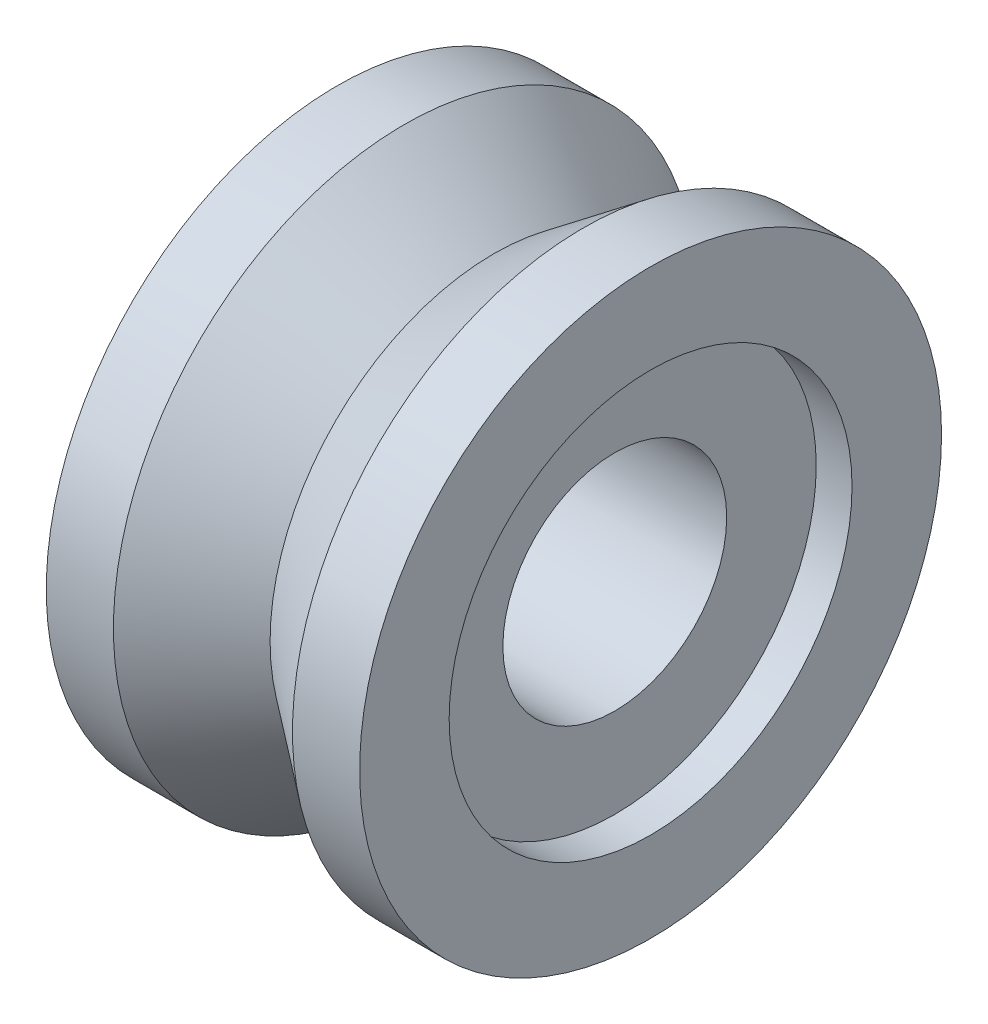
ISO-10303-21;
HEADER;
FILE_DESCRIPTION(('STEP AP214'),'2;1');
FILE_NAME('part.step','',(''),(''),'','','');
FILE_SCHEMA(('AUTOMOTIVE_DESIGN { 1 0 10303 214 1 1 1 1 }'));
ENDSEC;
DATA;
#1=APPLICATION_CONTEXT('core data for automotive mechanical design processes');
#2=APPLICATION_PROTOCOL_DEFINITION('international standard','automotive_design',2000,#1);
#3=PRODUCT_CONTEXT('',#1,'mechanical');
#4=PRODUCT('Part','Part','',(#3));
#5=PRODUCT_RELATED_PRODUCT_CATEGORY('part','',(#4));
#6=PRODUCT_DEFINITION_FORMATION('','',#4);
#7=PRODUCT_DEFINITION_CONTEXT('part definition',#1,'design');
#8=PRODUCT_DEFINITION('design','',#6,#7);
#9=PRODUCT_DEFINITION_SHAPE('','',#8);
#10=(LENGTH_UNIT() NAMED_UNIT(*) SI_UNIT(.MILLI.,.METRE.));
#11=(NAMED_UNIT(*) PLANE_ANGLE_UNIT() SI_UNIT($,.RADIAN.));
#12=(NAMED_UNIT(*) SI_UNIT($,.STERADIAN.) SOLID_ANGLE_UNIT());
#13=UNCERTAINTY_MEASURE_WITH_UNIT(LENGTH_MEASURE(1.E-05),#10,'distance_accuracy_value','');
#14=(GEOMETRIC_REPRESENTATION_CONTEXT(3) GLOBAL_UNCERTAINTY_ASSIGNED_CONTEXT((#13)) GLOBAL_UNIT_ASSIGNED_CONTEXT((#10,
#11,#12)) REPRESENTATION_CONTEXT('',''));
#15=CARTESIAN_POINT('',(0.,0.,0.));
#16=DIRECTION('',(0.,0.,1.));
#17=DIRECTION('',(1.,0.,0.));
#18=AXIS2_PLACEMENT_3D('',#15,#16,#17);
#19=CARTESIAN_POINT('',(-3.5,0.,0.));
#20=DIRECTION('',(1.,0.,0.));
#21=DIRECTION('',(0.,0.,-1.));
#22=AXIS2_PLACEMENT_3D('',#19,#20,#21);
#23=PLANE('',#22);
#24=CARTESIAN_POINT('',(-3.5,0.,0.));
#25=DIRECTION('',(1.,0.,0.));
#26=DIRECTION('',(0.,0.,-1.));
#27=AXIS2_PLACEMENT_3D('',#24,#25,#26);
#28=CIRCLE('',#27,6.5);
#29=CARTESIAN_POINT('',(-3.5,0.,-6.5));
#30=VERTEX_POINT('',#29);
#31=EDGE_CURVE('E46',#30,#30,#28,.T.);
#32=ORIENTED_EDGE('',*,*,#31,.F.);
#33=EDGE_LOOP('',(#32));
#34=FACE_BOUND('',#33,.T.);
#35=CARTESIAN_POINT('',(-3.5,0.,0.));
#36=DIRECTION('',(1.,0.,0.));
#37=DIRECTION('',(0.,0.,-1.));
#38=AXIS2_PLACEMENT_3D('',#35,#36,#37);
#39=CIRCLE('',#38,4.5);
#40=CARTESIAN_POINT('',(-3.5,0.,-4.5));
#41=VERTEX_POINT('',#40);
#42=EDGE_CURVE('E74',#41,#41,#39,.T.);
#43=ORIENTED_EDGE('',*,*,#42,.T.);
#44=EDGE_LOOP('',(#43));
#45=FACE_BOUND('',#44,.T.);
#46=ADVANCED_FACE('F37',(#34,#45),#23,.F.);
#47=CARTESIAN_POINT('',(3.5,0.,0.));
#48=DIRECTION('',(-1.,0.,0.));
#49=DIRECTION('',(0.,0.,1.));
#50=AXIS2_PLACEMENT_3D('',#47,#48,#49);
#51=CYLINDRICAL_SURFACE('',#50,6.5);
#52=CARTESIAN_POINT('',(-2.,0.,0.));
#53=DIRECTION('',(1.,0.,0.));
#54=DIRECTION('',(0.,0.,-1.));
#55=AXIS2_PLACEMENT_3D('',#52,#53,#54);
#56=CIRCLE('',#55,6.5);
#57=CARTESIAN_POINT('',(-2.,0.,-6.5));
#58=VERTEX_POINT('',#57);
#59=EDGE_CURVE('E52',#58,#58,#56,.T.);
#60=ORIENTED_EDGE('',*,*,#59,.F.);
#61=EDGE_LOOP('',(#60));
#62=FACE_BOUND('',#61,.T.);
#63=ORIENTED_EDGE('',*,*,#31,.T.);
#64=EDGE_LOOP('',(#63));
#65=FACE_BOUND('',#64,.T.);
#66=ADVANCED_FACE('F106',(#62,#65),#51,.T.);
#67=CARTESIAN_POINT('',(-2.,0.,0.));
#68=DIRECTION('',(-1.,0.,0.));
#69=DIRECTION('',(0.,0.,1.));
#70=AXIS2_PLACEMENT_3D('',#67,#68,#69);
#71=CONICAL_SURFACE('',#70,6.5,0.643501108793284);
#72=CARTESIAN_POINT('',(0.,0.,0.));
#73=DIRECTION('',(1.,0.,0.));
#74=DIRECTION('',(0.,0.,-1.));
#75=AXIS2_PLACEMENT_3D('',#72,#73,#74);
#76=CIRCLE('',#75,5.);
#77=CARTESIAN_POINT('',(0.,0.,-5.));
#78=VERTEX_POINT('',#77);
#79=EDGE_CURVE('E57',#78,#78,#76,.T.);
#80=ORIENTED_EDGE('',*,*,#79,.F.);
#81=EDGE_LOOP('',(#80));
#82=FACE_BOUND('',#81,.T.);
#83=ORIENTED_EDGE('',*,*,#59,.T.);
#84=EDGE_LOOP('',(#83));
#85=FACE_BOUND('',#84,.T.);
#86=ADVANCED_FACE('F111',(#82,#85),#71,.T.);
#87=CARTESIAN_POINT('',(0.,0.,0.));
#88=DIRECTION('',(1.,0.,0.));
#89=DIRECTION('',(0.,0.,-1.));
#90=AXIS2_PLACEMENT_3D('',#87,#88,#89);
#91=CONICAL_SURFACE('',#90,5.,0.643501108793284);
#92=CARTESIAN_POINT('',(2.,0.,0.));
#93=DIRECTION('',(1.,0.,0.));
#94=DIRECTION('',(0.,0.,-1.));
#95=AXIS2_PLACEMENT_3D('',#92,#93,#94);
#96=CIRCLE('',#95,6.5);
#97=CARTESIAN_POINT('',(2.,0.,-6.5));
#98=VERTEX_POINT('',#97);
#99=EDGE_CURVE('E61',#98,#98,#96,.T.);
#100=ORIENTED_EDGE('',*,*,#99,.F.);
#101=EDGE_LOOP('',(#100));
#102=FACE_BOUND('',#101,.T.);
#103=ORIENTED_EDGE('',*,*,#79,.T.);
#104=EDGE_LOOP('',(#103));
#105=FACE_BOUND('',#104,.T.);
#106=ADVANCED_FACE('F118',(#102,#105),#91,.T.);
#107=CARTESIAN_POINT('',(3.5,0.,0.));
#108=DIRECTION('',(1.,0.,0.));
#109=DIRECTION('',(0.,0.,-1.));
#110=AXIS2_PLACEMENT_3D('',#107,#108,#109);
#111=PLANE('',#110);
#112=CARTESIAN_POINT('',(3.5,0.,0.));
#113=DIRECTION('',(1.,0.,0.));
#114=DIRECTION('',(0.,0.,-1.));
#115=AXIS2_PLACEMENT_3D('',#112,#113,#114);
#116=CIRCLE('',#115,4.5);
#117=CARTESIAN_POINT('',(3.5,0.,-4.5));
#118=VERTEX_POINT('',#117);
#119=EDGE_CURVE('E66',#118,#118,#116,.T.);
#120=ORIENTED_EDGE('',*,*,#119,.F.);
#121=EDGE_LOOP('',(#120));
#122=FACE_BOUND('',#121,.T.);
#123=CARTESIAN_POINT('',(3.5,0.,0.));
#124=DIRECTION('',(1.,0.,0.));
#125=DIRECTION('',(0.,0.,-1.));
#126=AXIS2_PLACEMENT_3D('',#123,#124,#125);
#127=CIRCLE('',#126,6.5);
#128=CARTESIAN_POINT('',(3.5,0.,-6.5));
#129=VERTEX_POINT('',#128);
#130=EDGE_CURVE('E10',#129,#129,#127,.T.);
#131=ORIENTED_EDGE('',*,*,#130,.T.);
#132=EDGE_LOOP('',(#131));
#133=FACE_BOUND('',#132,.T.);
#134=ADVANCED_FACE('F115',(#122,#133),#111,.T.);
#135=ORIENTED_EDGE('',*,*,#99,.T.);
#136=EDGE_LOOP('',(#135));
#137=FACE_BOUND('',#136,.T.);
#138=ORIENTED_EDGE('',*,*,#130,.F.);
#139=EDGE_LOOP('',(#138));
#140=FACE_BOUND('',#139,.T.);
#141=ADVANCED_FACE('F39',(#137,#140),#51,.T.);
#142=CARTESIAN_POINT('',(2.7,0.,0.));
#143=DIRECTION('',(1.,0.,0.));
#144=DIRECTION('',(0.,0.,-1.));
#145=AXIS2_PLACEMENT_3D('',#142,#143,#144);
#146=CYLINDRICAL_SURFACE('',#145,4.5);
#147=CARTESIAN_POINT('',(2.7,0.,0.));
#148=DIRECTION('',(1.,0.,0.));
#149=DIRECTION('',(0.,0.,-1.));
#150=AXIS2_PLACEMENT_3D('',#147,#148,#149);
#151=CIRCLE('',#150,4.5);
#152=CARTESIAN_POINT('',(2.7,0.,-4.5));
#153=VERTEX_POINT('',#152);
#154=EDGE_CURVE('E65',#153,#153,#151,.T.);
#155=ORIENTED_EDGE('',*,*,#154,.F.);
#156=EDGE_LOOP('',(#155));
#157=FACE_BOUND('',#156,.T.);
#158=ORIENTED_EDGE('',*,*,#119,.T.);
#159=EDGE_LOOP('',(#158));
#160=FACE_BOUND('',#159,.T.);
#161=ADVANCED_FACE('F126',(#157,#160),#146,.F.);
#162=CARTESIAN_POINT('',(2.7,0.,0.));
#163=DIRECTION('',(1.,0.,0.));
#164=DIRECTION('',(0.,0.,-1.));
#165=AXIS2_PLACEMENT_3D('',#162,#163,#164);
#166=PLANE('',#165);
#167=CARTESIAN_POINT('',(2.7,0.,0.));
#168=DIRECTION('',(1.,0.,0.));
#169=DIRECTION('',(0.,0.,-1.));
#170=AXIS2_PLACEMENT_3D('',#167,#168,#169);
#171=CIRCLE('',#170,2.5);
#172=CARTESIAN_POINT('',(2.7,0.,-2.5));
#173=VERTEX_POINT('',#172);
#174=EDGE_CURVE('E78',#173,#173,#171,.T.);
#175=ORIENTED_EDGE('',*,*,#174,.F.);
#176=EDGE_LOOP('',(#175));
#177=FACE_BOUND('',#176,.T.);
#178=ORIENTED_EDGE('',*,*,#154,.T.);
#179=EDGE_LOOP('',(#178));
#180=FACE_BOUND('',#179,.T.);
#181=ADVANCED_FACE('F101',(#177,#180),#166,.T.);
#182=CARTESIAN_POINT('',(-2.7,0.,0.));
#183=DIRECTION('',(-1.,0.,0.));
#184=DIRECTION('',(0.,0.,1.));
#185=AXIS2_PLACEMENT_3D('',#182,#183,#184);
#186=CYLINDRICAL_SURFACE('',#185,4.5);
#187=CARTESIAN_POINT('',(-2.7,0.,0.));
#188=DIRECTION('',(1.,0.,0.));
#189=DIRECTION('',(0.,0.,-1.));
#190=AXIS2_PLACEMENT_3D('',#187,#188,#189);
#191=CIRCLE('',#190,4.5);
#192=CARTESIAN_POINT('',(-2.7,0.,-4.5));
#193=VERTEX_POINT('',#192);
#194=EDGE_CURVE('E70',#193,#193,#191,.T.);
#195=ORIENTED_EDGE('',*,*,#194,.T.);
#196=EDGE_LOOP('',(#195));
#197=FACE_BOUND('',#196,.T.);
#198=ORIENTED_EDGE('',*,*,#42,.F.);
#199=EDGE_LOOP('',(#198));
#200=FACE_BOUND('',#199,.T.);
#201=ADVANCED_FACE('F95',(#197,#200),#186,.F.);
#202=CARTESIAN_POINT('',(-2.7,0.,0.));
#203=DIRECTION('',(-1.,0.,0.));
#204=DIRECTION('',(0.,0.,-1.));
#205=AXIS2_PLACEMENT_3D('',#202,#203,#204);
#206=PLANE('',#205);
#207=CARTESIAN_POINT('',(-2.7,0.,0.));
#208=DIRECTION('',(-1.,0.,0.));
#209=DIRECTION('',(0.,0.,1.));
#210=AXIS2_PLACEMENT_3D('',#207,#208,#209);
#211=CIRCLE('',#210,2.5);
#212=CARTESIAN_POINT('',(-2.7,0.,2.5));
#213=VERTEX_POINT('',#212);
#214=EDGE_CURVE('E41',#213,#213,#211,.T.);
#215=ORIENTED_EDGE('',*,*,#214,.F.);
#216=EDGE_LOOP('',(#215));
#217=FACE_BOUND('',#216,.T.);
#218=ORIENTED_EDGE('',*,*,#194,.F.);
#219=EDGE_LOOP('',(#218));
#220=FACE_BOUND('',#219,.T.);
#221=ADVANCED_FACE('F92',(#217,#220),#206,.T.);
#222=CARTESIAN_POINT('',(-3.5,0.,0.));
#223=DIRECTION('',(1.,0.,0.));
#224=DIRECTION('',(0.,0.,-1.));
#225=AXIS2_PLACEMENT_3D('',#222,#223,#224);
#226=CYLINDRICAL_SURFACE('',#225,2.5);
#227=ORIENTED_EDGE('',*,*,#174,.T.);
#228=EDGE_LOOP('',(#227));
#229=FACE_BOUND('',#228,.T.);
#230=ORIENTED_EDGE('',*,*,#214,.T.);
#231=EDGE_LOOP('',(#230));
#232=FACE_BOUND('',#231,.T.);
#233=ADVANCED_FACE('F90',(#229,#232),#226,.F.);
#234=CLOSED_SHELL('',(#46,#66,#86,#106,#134,#141,#161,#181,#201,#221,#233));
#235=MANIFOLD_SOLID_BREP('B2',#234);
#236=ADVANCED_BREP_SHAPE_REPRESENTATION('',(#18,#235),#14);
#237=SHAPE_DEFINITION_REPRESENTATION(#9,#236);
ENDSEC;
END-ISO-10303-21;
